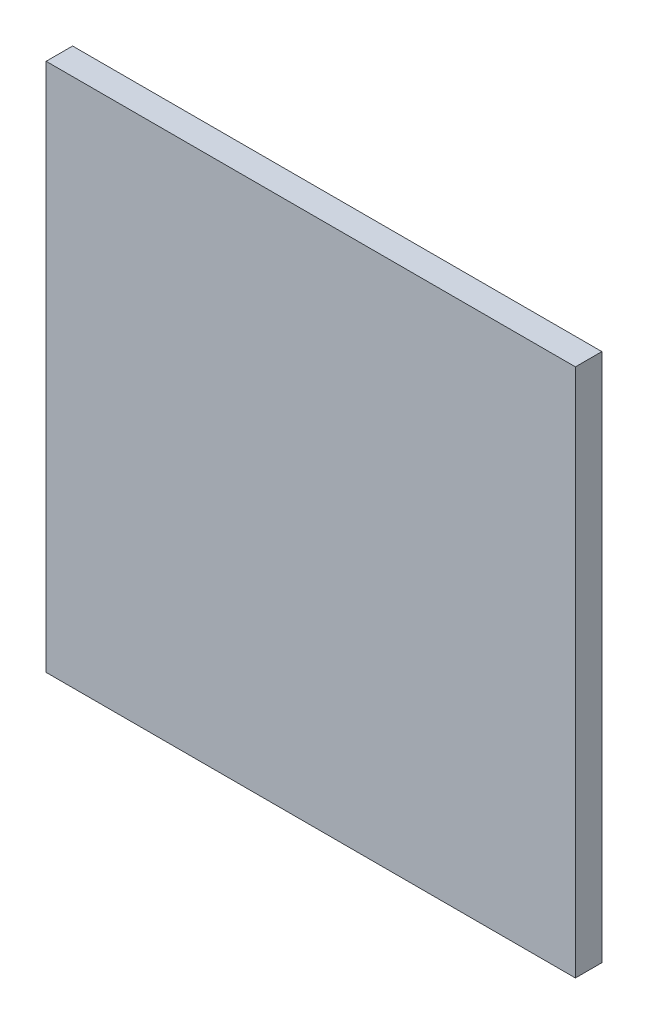
ISO-10303-21;
HEADER;
FILE_DESCRIPTION(('STEP AP214'),'2;1');
FILE_NAME('part.step','',(''),(''),'','','');
FILE_SCHEMA(('AUTOMOTIVE_DESIGN { 1 0 10303 214 1 1 1 1 }'));
ENDSEC;
DATA;
#1=APPLICATION_CONTEXT('core data for automotive mechanical design processes');
#2=APPLICATION_PROTOCOL_DEFINITION('international standard','automotive_design',2000,#1);
#3=PRODUCT_CONTEXT('',#1,'mechanical');
#4=PRODUCT('Part','Part','',(#3));
#5=PRODUCT_RELATED_PRODUCT_CATEGORY('part','',(#4));
#6=PRODUCT_DEFINITION_FORMATION('','',#4);
#7=PRODUCT_DEFINITION_CONTEXT('part definition',#1,'design');
#8=PRODUCT_DEFINITION('design','',#6,#7);
#9=PRODUCT_DEFINITION_SHAPE('','',#8);
#10=(LENGTH_UNIT() NAMED_UNIT(*) SI_UNIT(.MILLI.,.METRE.));
#11=(NAMED_UNIT(*) PLANE_ANGLE_UNIT() SI_UNIT($,.RADIAN.));
#12=(NAMED_UNIT(*) SI_UNIT($,.STERADIAN.) SOLID_ANGLE_UNIT());
#13=UNCERTAINTY_MEASURE_WITH_UNIT(LENGTH_MEASURE(1.E-05),#10,'distance_accuracy_value','');
#14=(GEOMETRIC_REPRESENTATION_CONTEXT(3) GLOBAL_UNCERTAINTY_ASSIGNED_CONTEXT((#13)) GLOBAL_UNIT_ASSIGNED_CONTEXT((#10,
#11,#12)) REPRESENTATION_CONTEXT('',''));
#15=CARTESIAN_POINT('',(0.,0.,0.));
#16=DIRECTION('',(0.,0.,1.));
#17=DIRECTION('',(1.,0.,0.));
#18=AXIS2_PLACEMENT_3D('',#15,#16,#17);
#19=CARTESIAN_POINT('',(31.75,31.75,3.175));
#20=DIRECTION('',(-1.,0.,0.));
#21=DIRECTION('',(0.,-1.,0.));
#22=AXIS2_PLACEMENT_3D('',#19,#20,#21);
#23=PLANE('',#22);
#24=DIRECTION('',(0.,1.,0.));
#25=VECTOR('',#24,1.);
#26=CARTESIAN_POINT('',(31.75,31.75,0.));
#27=LINE('',#26,#25);
#28=CARTESIAN_POINT('',(31.75,-31.75,0.));
#29=VERTEX_POINT('',#28);
#30=CARTESIAN_POINT('',(31.75,31.75,0.));
#31=VERTEX_POINT('',#30);
#32=EDGE_CURVE('E99',#29,#31,#27,.T.);
#33=ORIENTED_EDGE('',*,*,#32,.T.);
#34=DIRECTION('',(0.,0.,-1.));
#35=VECTOR('',#34,1.);
#36=CARTESIAN_POINT('',(31.75,31.75,3.175));
#37=LINE('',#36,#35);
#38=CARTESIAN_POINT('',(31.75,31.75,3.175));
#39=VERTEX_POINT('',#38);
#40=EDGE_CURVE('E11',#39,#31,#37,.T.);
#41=ORIENTED_EDGE('',*,*,#40,.F.);
#42=DIRECTION('',(0.,1.,0.));
#43=VECTOR('',#42,1.);
#44=CARTESIAN_POINT('',(31.75,31.75,3.175));
#45=LINE('',#44,#43);
#46=CARTESIAN_POINT('',(31.75,-31.75,3.175));
#47=VERTEX_POINT('',#46);
#48=EDGE_CURVE('E87',#47,#39,#45,.T.);
#49=ORIENTED_EDGE('',*,*,#48,.F.);
#50=DIRECTION('',(0.,0.,-1.));
#51=VECTOR('',#50,1.);
#52=CARTESIAN_POINT('',(31.75,-31.75,3.175));
#53=LINE('',#52,#51);
#54=EDGE_CURVE('E95',#47,#29,#53,.T.);
#55=ORIENTED_EDGE('',*,*,#54,.T.);
#56=EDGE_LOOP('',(#33,#41,#49,#55));
#57=FACE_BOUND('',#56,.T.);
#58=ADVANCED_FACE('F36',(#57),#23,.F.);
#59=CARTESIAN_POINT('',(-31.75,31.75,3.175));
#60=DIRECTION('',(0.,-1.,0.));
#61=DIRECTION('',(0.,0.,-1.));
#62=AXIS2_PLACEMENT_3D('',#59,#60,#61);
#63=PLANE('',#62);
#64=DIRECTION('',(-1.,0.,0.));
#65=VECTOR('',#64,1.);
#66=CARTESIAN_POINT('',(-31.75,31.75,0.));
#67=LINE('',#66,#65);
#68=CARTESIAN_POINT('',(-31.75,31.75,0.));
#69=VERTEX_POINT('',#68);
#70=EDGE_CURVE('E91',#31,#69,#67,.T.);
#71=ORIENTED_EDGE('',*,*,#70,.T.);
#72=DIRECTION('',(0.,0.,-1.));
#73=VECTOR('',#72,1.);
#74=CARTESIAN_POINT('',(-31.75,31.75,3.175));
#75=LINE('',#74,#73);
#76=CARTESIAN_POINT('',(-31.75,31.75,3.175));
#77=VERTEX_POINT('',#76);
#78=EDGE_CURVE('E44',#77,#69,#75,.T.);
#79=ORIENTED_EDGE('',*,*,#78,.F.);
#80=DIRECTION('',(-1.,0.,0.));
#81=VECTOR('',#80,1.);
#82=CARTESIAN_POINT('',(-31.75,31.75,3.175));
#83=LINE('',#82,#81);
#84=EDGE_CURVE('E82',#39,#77,#83,.T.);
#85=ORIENTED_EDGE('',*,*,#84,.F.);
#86=ORIENTED_EDGE('',*,*,#40,.T.);
#87=EDGE_LOOP('',(#71,#79,#85,#86));
#88=FACE_BOUND('',#87,.T.);
#89=ADVANCED_FACE('F90',(#88),#63,.F.);
#90=CARTESIAN_POINT('',(-31.75,31.75,3.175));
#91=DIRECTION('',(1.,0.,0.));
#92=DIRECTION('',(0.,1.,0.));
#93=AXIS2_PLACEMENT_3D('',#90,#91,#92);
#94=PLANE('',#93);
#95=DIRECTION('',(0.,-1.,0.));
#96=VECTOR('',#95,1.);
#97=CARTESIAN_POINT('',(-31.75,31.75,0.));
#98=LINE('',#97,#96);
#99=CARTESIAN_POINT('',(-31.75,-31.75,0.));
#100=VERTEX_POINT('',#99);
#101=EDGE_CURVE('E69',#69,#100,#98,.T.);
#102=ORIENTED_EDGE('',*,*,#101,.T.);
#103=DIRECTION('',(0.,0.,-1.));
#104=VECTOR('',#103,1.);
#105=CARTESIAN_POINT('',(-31.75,-31.75,3.175));
#106=LINE('',#105,#104);
#107=CARTESIAN_POINT('',(-31.75,-31.75,3.175));
#108=VERTEX_POINT('',#107);
#109=EDGE_CURVE('E92',#108,#100,#106,.T.);
#110=ORIENTED_EDGE('',*,*,#109,.F.);
#111=DIRECTION('',(0.,-1.,0.));
#112=VECTOR('',#111,1.);
#113=CARTESIAN_POINT('',(-31.75,31.75,3.175));
#114=LINE('',#113,#112);
#115=EDGE_CURVE('E85',#77,#108,#114,.T.);
#116=ORIENTED_EDGE('',*,*,#115,.F.);
#117=ORIENTED_EDGE('',*,*,#78,.T.);
#118=EDGE_LOOP('',(#102,#110,#116,#117));
#119=FACE_BOUND('',#118,.T.);
#120=ADVANCED_FACE('F93',(#119),#94,.F.);
#121=CARTESIAN_POINT('',(-31.75,-31.75,3.175));
#122=DIRECTION('',(0.,1.,0.));
#123=DIRECTION('',(0.,0.,1.));
#124=AXIS2_PLACEMENT_3D('',#121,#122,#123);
#125=PLANE('',#124);
#126=DIRECTION('',(1.,0.,0.));
#127=VECTOR('',#126,1.);
#128=CARTESIAN_POINT('',(-31.75,-31.75,0.));
#129=LINE('',#128,#127);
#130=EDGE_CURVE('E75',#100,#29,#129,.T.);
#131=ORIENTED_EDGE('',*,*,#130,.T.);
#132=ORIENTED_EDGE('',*,*,#54,.F.);
#133=DIRECTION('',(1.,0.,0.));
#134=VECTOR('',#133,1.);
#135=CARTESIAN_POINT('',(-31.75,-31.75,3.175));
#136=LINE('',#135,#134);
#137=EDGE_CURVE('E52',#108,#47,#136,.T.);
#138=ORIENTED_EDGE('',*,*,#137,.F.);
#139=ORIENTED_EDGE('',*,*,#109,.T.);
#140=EDGE_LOOP('',(#131,#132,#138,#139));
#141=FACE_BOUND('',#140,.T.);
#142=ADVANCED_FACE('F106',(#141),#125,.F.);
#143=CARTESIAN_POINT('',(0.,0.,3.175));
#144=DIRECTION('',(0.,0.,1.));
#145=DIRECTION('',(1.,0.,0.));
#146=AXIS2_PLACEMENT_3D('',#143,#144,#145);
#147=PLANE('',#146);
#148=ORIENTED_EDGE('',*,*,#48,.T.);
#149=ORIENTED_EDGE('',*,*,#84,.T.);
#150=ORIENTED_EDGE('',*,*,#115,.T.);
#151=ORIENTED_EDGE('',*,*,#137,.T.);
#152=EDGE_LOOP('',(#148,#149,#150,#151));
#153=FACE_BOUND('',#152,.T.);
#154=ADVANCED_FACE('F83',(#153),#147,.T.);
#155=CARTESIAN_POINT('',(0.,0.,0.));
#156=DIRECTION('',(0.,0.,1.));
#157=DIRECTION('',(1.,0.,0.));
#158=AXIS2_PLACEMENT_3D('',#155,#156,#157);
#159=PLANE('',#158);
#160=ORIENTED_EDGE('',*,*,#32,.F.);
#161=ORIENTED_EDGE('',*,*,#130,.F.);
#162=ORIENTED_EDGE('',*,*,#101,.F.);
#163=ORIENTED_EDGE('',*,*,#70,.F.);
#164=EDGE_LOOP('',(#160,#161,#162,#163));
#165=FACE_BOUND('',#164,.T.);
#166=ADVANCED_FACE('F109',(#165),#159,.F.);
#167=CLOSED_SHELL('',(#58,#89,#120,#142,#154,#166));
#168=MANIFOLD_SOLID_BREP('B2',#167);
#169=ADVANCED_BREP_SHAPE_REPRESENTATION('',(#18,#168),#14);
#170=SHAPE_DEFINITION_REPRESENTATION(#9,#169);
ENDSEC;
END-ISO-10303-21;
